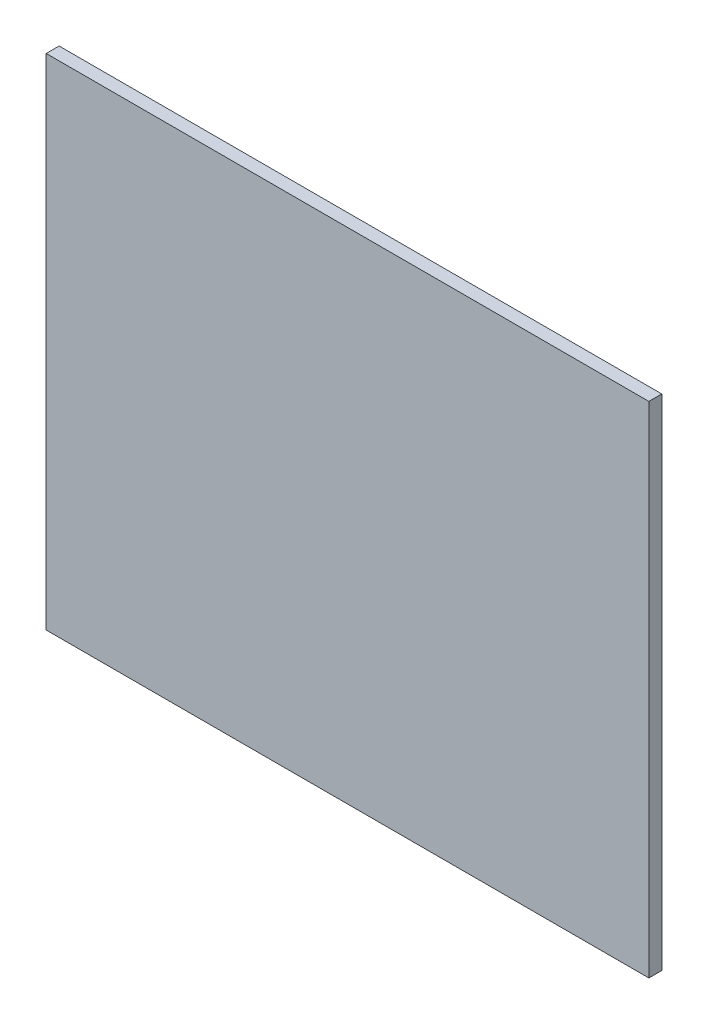
ISO-10303-21;
HEADER;
FILE_DESCRIPTION(('STEP AP214'),'2;1');
FILE_NAME('part.step','',(''),(''),'','','');
FILE_SCHEMA(('AUTOMOTIVE_DESIGN { 1 0 10303 214 1 1 1 1 }'));
ENDSEC;
DATA;
#1=APPLICATION_CONTEXT('core data for automotive mechanical design processes');
#2=APPLICATION_PROTOCOL_DEFINITION('international standard','automotive_design',2000,#1);
#3=PRODUCT_CONTEXT('',#1,'mechanical');
#4=PRODUCT('Part','Part','',(#3));
#5=PRODUCT_RELATED_PRODUCT_CATEGORY('part','',(#4));
#6=PRODUCT_DEFINITION_FORMATION('','',#4);
#7=PRODUCT_DEFINITION_CONTEXT('part definition',#1,'design');
#8=PRODUCT_DEFINITION('design','',#6,#7);
#9=PRODUCT_DEFINITION_SHAPE('','',#8);
#10=(LENGTH_UNIT() NAMED_UNIT(*) SI_UNIT(.MILLI.,.METRE.));
#11=(NAMED_UNIT(*) PLANE_ANGLE_UNIT() SI_UNIT($,.RADIAN.));
#12=(NAMED_UNIT(*) SI_UNIT($,.STERADIAN.) SOLID_ANGLE_UNIT());
#13=UNCERTAINTY_MEASURE_WITH_UNIT(LENGTH_MEASURE(1.E-05),#10,'distance_accuracy_value','');
#14=(GEOMETRIC_REPRESENTATION_CONTEXT(3) GLOBAL_UNCERTAINTY_ASSIGNED_CONTEXT((#13)) GLOBAL_UNIT_ASSIGNED_CONTEXT((#10,
#11,#12)) REPRESENTATION_CONTEXT('',''));
#15=CARTESIAN_POINT('',(0.,0.,0.));
#16=DIRECTION('',(0.,0.,1.));
#17=DIRECTION('',(1.,0.,0.));
#18=AXIS2_PLACEMENT_3D('',#15,#16,#17);
#19=CARTESIAN_POINT('',(0.,0.,15.));
#20=DIRECTION('',(1.,0.,0.));
#21=DIRECTION('',(0.,0.,-1.));
#22=AXIS2_PLACEMENT_3D('',#19,#20,#21);
#23=PLANE('',#22);
#24=DIRECTION('',(0.,-1.,0.));
#25=VECTOR('',#24,1.);
#26=CARTESIAN_POINT('',(0.,0.,0.));
#27=LINE('',#26,#25);
#28=CARTESIAN_POINT('',(0.,580.,0.));
#29=VERTEX_POINT('',#28);
#30=CARTESIAN_POINT('',(0.,0.,0.));
#31=VERTEX_POINT('',#30);
#32=EDGE_CURVE('E95',#29,#31,#27,.T.);
#33=ORIENTED_EDGE('',*,*,#32,.T.);
#34=DIRECTION('',(0.,0.,-1.));
#35=VECTOR('',#34,1.);
#36=CARTESIAN_POINT('',(0.,0.,15.));
#37=LINE('',#36,#35);
#38=CARTESIAN_POINT('',(0.,0.,15.));
#39=VERTEX_POINT('',#38);
#40=EDGE_CURVE('E11',#39,#31,#37,.T.);
#41=ORIENTED_EDGE('',*,*,#40,.F.);
#42=DIRECTION('',(0.,-1.,0.));
#43=VECTOR('',#42,1.);
#44=CARTESIAN_POINT('',(0.,0.,15.));
#45=LINE('',#44,#43);
#46=CARTESIAN_POINT('',(0.,580.,15.));
#47=VERTEX_POINT('',#46);
#48=EDGE_CURVE('E83',#47,#39,#45,.T.);
#49=ORIENTED_EDGE('',*,*,#48,.F.);
#50=DIRECTION('',(0.,0.,-1.));
#51=VECTOR('',#50,1.);
#52=CARTESIAN_POINT('',(0.,580.,15.));
#53=LINE('',#52,#51);
#54=EDGE_CURVE('E91',#47,#29,#53,.T.);
#55=ORIENTED_EDGE('',*,*,#54,.T.);
#56=EDGE_LOOP('',(#33,#41,#49,#55));
#57=FACE_BOUND('',#56,.T.);
#58=ADVANCED_FACE('F32',(#57),#23,.F.);
#59=CARTESIAN_POINT('',(0.,0.,15.));
#60=DIRECTION('',(0.,1.,0.));
#61=DIRECTION('',(0.,0.,1.));
#62=AXIS2_PLACEMENT_3D('',#59,#60,#61);
#63=PLANE('',#62);
#64=DIRECTION('',(1.,0.,0.));
#65=VECTOR('',#64,1.);
#66=CARTESIAN_POINT('',(0.,0.,0.));
#67=LINE('',#66,#65);
#68=CARTESIAN_POINT('',(700.,0.,0.));
#69=VERTEX_POINT('',#68);
#70=EDGE_CURVE('E87',#31,#69,#67,.T.);
#71=ORIENTED_EDGE('',*,*,#70,.T.);
#72=DIRECTION('',(0.,0.,-1.));
#73=VECTOR('',#72,1.);
#74=CARTESIAN_POINT('',(700.,0.,15.));
#75=LINE('',#74,#73);
#76=CARTESIAN_POINT('',(700.,0.,15.));
#77=VERTEX_POINT('',#76);
#78=EDGE_CURVE('E40',#77,#69,#75,.T.);
#79=ORIENTED_EDGE('',*,*,#78,.F.);
#80=DIRECTION('',(1.,0.,0.));
#81=VECTOR('',#80,1.);
#82=CARTESIAN_POINT('',(0.,0.,15.));
#83=LINE('',#82,#81);
#84=EDGE_CURVE('E78',#39,#77,#83,.T.);
#85=ORIENTED_EDGE('',*,*,#84,.F.);
#86=ORIENTED_EDGE('',*,*,#40,.T.);
#87=EDGE_LOOP('',(#71,#79,#85,#86));
#88=FACE_BOUND('',#87,.T.);
#89=ADVANCED_FACE('F86',(#88),#63,.F.);
#90=CARTESIAN_POINT('',(700.,0.,15.));
#91=DIRECTION('',(-1.,0.,0.));
#92=DIRECTION('',(0.,0.,1.));
#93=AXIS2_PLACEMENT_3D('',#90,#91,#92);
#94=PLANE('',#93);
#95=DIRECTION('',(0.,1.,0.));
#96=VECTOR('',#95,1.);
#97=CARTESIAN_POINT('',(700.,0.,0.));
#98=LINE('',#97,#96);
#99=CARTESIAN_POINT('',(700.,580.,0.));
#100=VERTEX_POINT('',#99);
#101=EDGE_CURVE('E65',#69,#100,#98,.T.);
#102=ORIENTED_EDGE('',*,*,#101,.T.);
#103=DIRECTION('',(0.,0.,-1.));
#104=VECTOR('',#103,1.);
#105=CARTESIAN_POINT('',(700.,580.,15.));
#106=LINE('',#105,#104);
#107=CARTESIAN_POINT('',(700.,580.,15.));
#108=VERTEX_POINT('',#107);
#109=EDGE_CURVE('E88',#108,#100,#106,.T.);
#110=ORIENTED_EDGE('',*,*,#109,.F.);
#111=DIRECTION('',(0.,1.,0.));
#112=VECTOR('',#111,1.);
#113=CARTESIAN_POINT('',(700.,0.,15.));
#114=LINE('',#113,#112);
#115=EDGE_CURVE('E81',#77,#108,#114,.T.);
#116=ORIENTED_EDGE('',*,*,#115,.F.);
#117=ORIENTED_EDGE('',*,*,#78,.T.);
#118=EDGE_LOOP('',(#102,#110,#116,#117));
#119=FACE_BOUND('',#118,.T.);
#120=ADVANCED_FACE('F89',(#119),#94,.F.);
#121=CARTESIAN_POINT('',(0.,580.,15.));
#122=DIRECTION('',(0.,-1.,0.));
#123=DIRECTION('',(0.,0.,-1.));
#124=AXIS2_PLACEMENT_3D('',#121,#122,#123);
#125=PLANE('',#124);
#126=DIRECTION('',(-1.,0.,0.));
#127=VECTOR('',#126,1.);
#128=CARTESIAN_POINT('',(0.,580.,0.));
#129=LINE('',#128,#127);
#130=EDGE_CURVE('E71',#100,#29,#129,.T.);
#131=ORIENTED_EDGE('',*,*,#130,.T.);
#132=ORIENTED_EDGE('',*,*,#54,.F.);
#133=DIRECTION('',(-1.,0.,0.));
#134=VECTOR('',#133,1.);
#135=CARTESIAN_POINT('',(0.,580.,15.));
#136=LINE('',#135,#134);
#137=EDGE_CURVE('E48',#108,#47,#136,.T.);
#138=ORIENTED_EDGE('',*,*,#137,.F.);
#139=ORIENTED_EDGE('',*,*,#109,.T.);
#140=EDGE_LOOP('',(#131,#132,#138,#139));
#141=FACE_BOUND('',#140,.T.);
#142=ADVANCED_FACE('F102',(#141),#125,.F.);
#143=CARTESIAN_POINT('',(0.,0.,15.));
#144=DIRECTION('',(0.,0.,-1.));
#145=DIRECTION('',(-1.,0.,0.));
#146=AXIS2_PLACEMENT_3D('',#143,#144,#145);
#147=PLANE('',#146);
#148=ORIENTED_EDGE('',*,*,#48,.T.);
#149=ORIENTED_EDGE('',*,*,#84,.T.);
#150=ORIENTED_EDGE('',*,*,#115,.T.);
#151=ORIENTED_EDGE('',*,*,#137,.T.);
#152=EDGE_LOOP('',(#148,#149,#150,#151));
#153=FACE_BOUND('',#152,.T.);
#154=ADVANCED_FACE('F79',(#153),#147,.F.);
#155=CARTESIAN_POINT('',(0.,0.,0.));
#156=DIRECTION('',(0.,0.,-1.));
#157=DIRECTION('',(-1.,0.,0.));
#158=AXIS2_PLACEMENT_3D('',#155,#156,#157);
#159=PLANE('',#158);
#160=ORIENTED_EDGE('',*,*,#32,.F.);
#161=ORIENTED_EDGE('',*,*,#130,.F.);
#162=ORIENTED_EDGE('',*,*,#101,.F.);
#163=ORIENTED_EDGE('',*,*,#70,.F.);
#164=EDGE_LOOP('',(#160,#161,#162,#163));
#165=FACE_BOUND('',#164,.T.);
#166=ADVANCED_FACE('F105',(#165),#159,.T.);
#167=CLOSED_SHELL('',(#58,#89,#120,#142,#154,#166));
#168=MANIFOLD_SOLID_BREP('B2',#167);
#169=ADVANCED_BREP_SHAPE_REPRESENTATION('',(#18,#168),#14);
#170=SHAPE_DEFINITION_REPRESENTATION(#9,#169);
ENDSEC;
END-ISO-10303-21;
